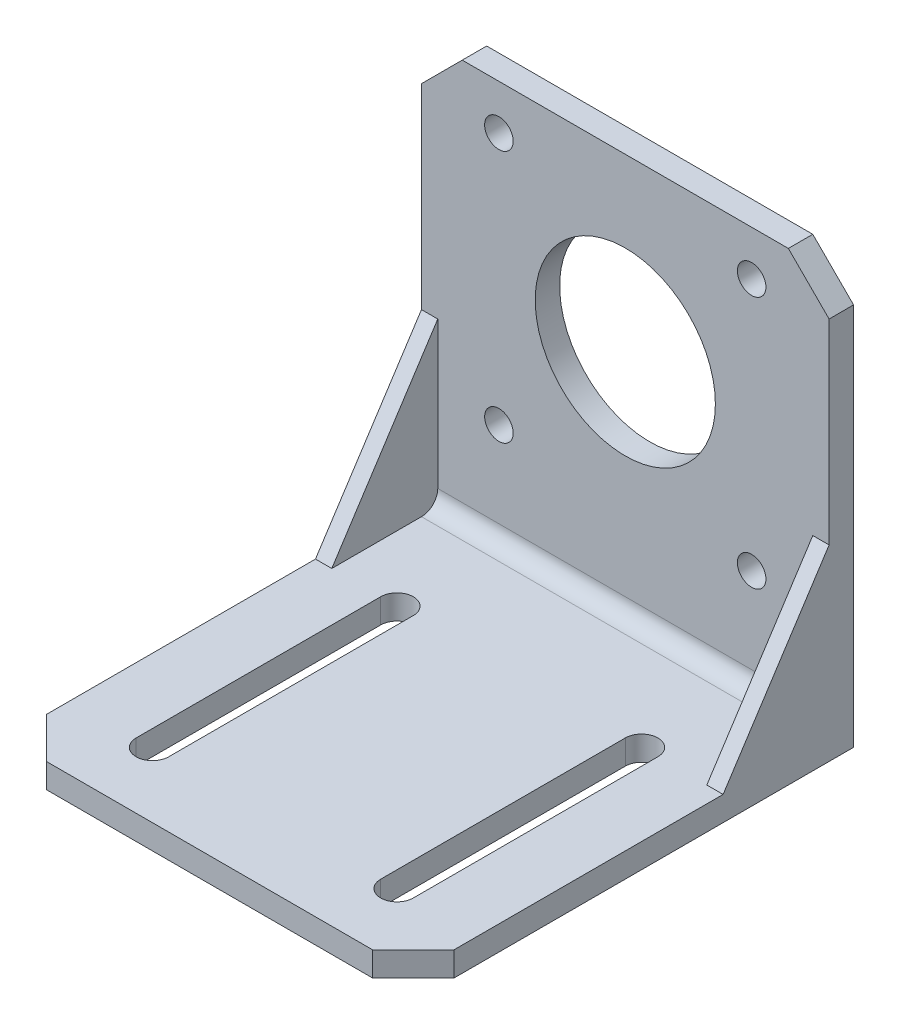
ISO-10303-21;
HEADER;
FILE_DESCRIPTION(('STEP AP214'),'2;1');
FILE_NAME('part.step','',(''),(''),'','','');
FILE_SCHEMA(('AUTOMOTIVE_DESIGN { 1 0 10303 214 1 1 1 1 }'));
ENDSEC;
DATA;
#1=APPLICATION_CONTEXT('core data for automotive mechanical design processes');
#2=APPLICATION_PROTOCOL_DEFINITION('international standard','automotive_design',2000,#1);
#3=PRODUCT_CONTEXT('',#1,'mechanical');
#4=PRODUCT('Part','Part','',(#3));
#5=PRODUCT_RELATED_PRODUCT_CATEGORY('part','',(#4));
#6=PRODUCT_DEFINITION_FORMATION('','',#4);
#7=PRODUCT_DEFINITION_CONTEXT('part definition',#1,'design');
#8=PRODUCT_DEFINITION('design','',#6,#7);
#9=PRODUCT_DEFINITION_SHAPE('','',#8);
#10=(LENGTH_UNIT() NAMED_UNIT(*) SI_UNIT(.MILLI.,.METRE.));
#11=(NAMED_UNIT(*) PLANE_ANGLE_UNIT() SI_UNIT($,.RADIAN.));
#12=(NAMED_UNIT(*) SI_UNIT($,.STERADIAN.) SOLID_ANGLE_UNIT());
#13=UNCERTAINTY_MEASURE_WITH_UNIT(LENGTH_MEASURE(1.E-05),#10,'distance_accuracy_value','');
#14=(GEOMETRIC_REPRESENTATION_CONTEXT(3) GLOBAL_UNCERTAINTY_ASSIGNED_CONTEXT((#13)) GLOBAL_UNIT_ASSIGNED_CONTEXT((#10,
#11,#12)) REPRESENTATION_CONTEXT('',''));
#15=CARTESIAN_POINT('',(0.,0.,0.));
#16=DIRECTION('',(0.,0.,1.));
#17=DIRECTION('',(1.,0.,0.));
#18=AXIS2_PLACEMENT_3D('',#15,#16,#17);
#19=CARTESIAN_POINT('',(20.,21.,-3.));
#20=DIRECTION('',(0.707106781186547,0.707106781186547,0.));
#21=DIRECTION('',(-0.707106781186548,0.707106781186548,0.));
#22=AXIS2_PLACEMENT_3D('',#19,#20,#21);
#23=PLANE('',#22);
#24=DIRECTION('',(-0.707106781186548,0.707106781186548,0.));
#25=VECTOR('',#24,1.);
#26=CARTESIAN_POINT('',(20.,21.,0.));
#27=LINE('',#26,#25);
#28=CARTESIAN_POINT('',(25.,16.,0.));
#29=VERTEX_POINT('',#28);
#30=CARTESIAN_POINT('',(20.,21.,0.));
#31=VERTEX_POINT('',#30);
#32=EDGE_CURVE('E357',#29,#31,#27,.T.);
#33=ORIENTED_EDGE('',*,*,#32,.F.);
#34=DIRECTION('',(0.,0.,1.));
#35=VECTOR('',#34,1.);
#36=CARTESIAN_POINT('',(25.,16.,-3.));
#37=LINE('',#36,#35);
#38=CARTESIAN_POINT('',(25.,16.,-3.));
#39=VERTEX_POINT('',#38);
#40=EDGE_CURVE('E386',#39,#29,#37,.T.);
#41=ORIENTED_EDGE('',*,*,#40,.F.);
#42=DIRECTION('',(-0.707106781186548,0.707106781186548,0.));
#43=VECTOR('',#42,1.);
#44=CARTESIAN_POINT('',(20.,21.,-3.));
#45=LINE('',#44,#43);
#46=CARTESIAN_POINT('',(20.,21.,-3.));
#47=VERTEX_POINT('',#46);
#48=EDGE_CURVE('E360',#39,#47,#45,.T.);
#49=ORIENTED_EDGE('',*,*,#48,.T.);
#50=DIRECTION('',(0.,0.,1.));
#51=VECTOR('',#50,1.);
#52=CARTESIAN_POINT('',(20.,21.,-3.));
#53=LINE('',#52,#51);
#54=EDGE_CURVE('E374',#47,#31,#53,.T.);
#55=ORIENTED_EDGE('',*,*,#54,.T.);
#56=EDGE_LOOP('',(#33,#41,#49,#55));
#57=FACE_BOUND('',#56,.T.);
#58=ADVANCED_FACE('F41',(#57),#23,.T.);
#59=CARTESIAN_POINT('',(25.,16.,-3.));
#60=DIRECTION('',(1.,0.,0.));
#61=DIRECTION('',(0.,1.,0.));
#62=AXIS2_PLACEMENT_3D('',#59,#60,#61);
#63=PLANE('',#62);
#64=DIRECTION('',(0.,1.,0.));
#65=VECTOR('',#64,1.);
#66=CARTESIAN_POINT('',(25.,-31.,46.));
#67=LINE('',#66,#65);
#68=CARTESIAN_POINT('',(25.,-31.,46.));
#69=VERTEX_POINT('',#68);
#70=CARTESIAN_POINT('',(25.,-28.,46.));
#71=VERTEX_POINT('',#70);
#72=EDGE_CURVE('E326',#69,#71,#67,.T.);
#73=ORIENTED_EDGE('',*,*,#72,.F.);
#74=DIRECTION('',(0.,0.,1.));
#75=VECTOR('',#74,1.);
#76=CARTESIAN_POINT('',(25.,-31.,-3.));
#77=LINE('',#76,#75);
#78=CARTESIAN_POINT('',(25.,-31.,-3.));
#79=VERTEX_POINT('',#78);
#80=EDGE_CURVE('E296',#79,#69,#77,.T.);
#81=ORIENTED_EDGE('',*,*,#80,.F.);
#82=DIRECTION('',(0.,1.,0.));
#83=VECTOR('',#82,1.);
#84=CARTESIAN_POINT('',(25.,16.,-3.));
#85=LINE('',#84,#83);
#86=EDGE_CURVE('E372',#79,#39,#85,.T.);
#87=ORIENTED_EDGE('',*,*,#86,.T.);
#88=ORIENTED_EDGE('',*,*,#40,.T.);
#89=DIRECTION('',(0.,1.,0.));
#90=VECTOR('',#89,1.);
#91=CARTESIAN_POINT('',(25.,16.,0.));
#92=LINE('',#91,#90);
#93=CARTESIAN_POINT('',(25.,-8.,0.));
#94=VERTEX_POINT('',#93);
#95=EDGE_CURVE('E364',#94,#29,#92,.T.);
#96=ORIENTED_EDGE('',*,*,#95,.F.);
#97=DIRECTION('',(0.,-0.838443616300637,0.544988350595414));
#98=VECTOR('',#97,1.);
#99=CARTESIAN_POINT('',(25.,-8.,0.));
#100=LINE('',#99,#98);
#101=CARTESIAN_POINT('',(25.,-28.,13.));
#102=VERTEX_POINT('',#101);
#103=EDGE_CURVE('E213',#94,#102,#100,.T.);
#104=ORIENTED_EDGE('',*,*,#103,.T.);
#105=DIRECTION('',(0.,0.,1.));
#106=VECTOR('',#105,1.);
#107=CARTESIAN_POINT('',(25.,-28.,-3.));
#108=LINE('',#107,#106);
#109=EDGE_CURVE('E204',#102,#71,#108,.T.);
#110=ORIENTED_EDGE('',*,*,#109,.T.);
#111=EDGE_LOOP('',(#73,#81,#87,#88,#96,#104,#110));
#112=FACE_BOUND('',#111,.T.);
#113=ADVANCED_FACE('F435',(#112),#63,.T.);
#114=CARTESIAN_POINT('',(-25.,16.,-3.));
#115=DIRECTION('',(-1.,0.,0.));
#116=DIRECTION('',(0.,-1.,0.));
#117=AXIS2_PLACEMENT_3D('',#114,#115,#116);
#118=PLANE('',#117);
#119=DIRECTION('',(0.,-0.838443616300637,0.544988350595414));
#120=VECTOR('',#119,1.);
#121=CARTESIAN_POINT('',(-25.,-8.,0.));
#122=LINE('',#121,#120);
#123=CARTESIAN_POINT('',(-25.,-8.,0.));
#124=VERTEX_POINT('',#123);
#125=CARTESIAN_POINT('',(-25.,-28.,13.));
#126=VERTEX_POINT('',#125);
#127=EDGE_CURVE('E221',#124,#126,#122,.T.);
#128=ORIENTED_EDGE('',*,*,#127,.F.);
#129=DIRECTION('',(0.,-1.,0.));
#130=VECTOR('',#129,1.);
#131=CARTESIAN_POINT('',(-25.,16.,0.));
#132=LINE('',#131,#130);
#133=CARTESIAN_POINT('',(-25.,16.,0.));
#134=VERTEX_POINT('',#133);
#135=EDGE_CURVE('E383',#134,#124,#132,.T.);
#136=ORIENTED_EDGE('',*,*,#135,.F.);
#137=DIRECTION('',(0.,0.,1.));
#138=VECTOR('',#137,1.);
#139=CARTESIAN_POINT('',(-25.,16.,-3.));
#140=LINE('',#139,#138);
#141=CARTESIAN_POINT('',(-25.,16.,-3.));
#142=VERTEX_POINT('',#141);
#143=EDGE_CURVE('E390',#142,#134,#140,.T.);
#144=ORIENTED_EDGE('',*,*,#143,.F.);
#145=DIRECTION('',(0.,-1.,0.));
#146=VECTOR('',#145,1.);
#147=CARTESIAN_POINT('',(-25.,16.,-3.));
#148=LINE('',#147,#146);
#149=CARTESIAN_POINT('',(-25.,-31.,-3.));
#150=VERTEX_POINT('',#149);
#151=EDGE_CURVE('E370',#142,#150,#148,.T.);
#152=ORIENTED_EDGE('',*,*,#151,.T.);
#153=DIRECTION('',(0.,0.,-1.));
#154=VECTOR('',#153,1.);
#155=CARTESIAN_POINT('',(-25.,-31.,-3.));
#156=LINE('',#155,#154);
#157=CARTESIAN_POINT('',(-25.,-31.,46.));
#158=VERTEX_POINT('',#157);
#159=EDGE_CURVE('E305',#158,#150,#156,.T.);
#160=ORIENTED_EDGE('',*,*,#159,.F.);
#161=DIRECTION('',(0.,1.,0.));
#162=VECTOR('',#161,1.);
#163=CARTESIAN_POINT('',(-25.,-31.,46.));
#164=LINE('',#163,#162);
#165=CARTESIAN_POINT('',(-25.,-28.,46.));
#166=VERTEX_POINT('',#165);
#167=EDGE_CURVE('E308',#158,#166,#164,.T.);
#168=ORIENTED_EDGE('',*,*,#167,.T.);
#169=DIRECTION('',(0.,0.,-1.));
#170=VECTOR('',#169,1.);
#171=CARTESIAN_POINT('',(-25.,-28.,-3.));
#172=LINE('',#171,#170);
#173=EDGE_CURVE('E297',#166,#126,#172,.T.);
#174=ORIENTED_EDGE('',*,*,#173,.T.);
#175=EDGE_LOOP('',(#128,#136,#144,#152,#160,#168,#174));
#176=FACE_BOUND('',#175,.T.);
#177=ADVANCED_FACE('F416',(#176),#118,.T.);
#178=CARTESIAN_POINT('',(-25.,16.,-3.));
#179=DIRECTION('',(-0.707106781186548,0.707106781186547,0.));
#180=DIRECTION('',(-0.707106781186547,-0.707106781186548,0.));
#181=AXIS2_PLACEMENT_3D('',#178,#179,#180);
#182=PLANE('',#181);
#183=DIRECTION('',(-0.707106781186547,-0.707106781186548,0.));
#184=VECTOR('',#183,1.);
#185=CARTESIAN_POINT('',(-25.,16.,0.));
#186=LINE('',#185,#184);
#187=CARTESIAN_POINT('',(-20.,21.,0.));
#188=VERTEX_POINT('',#187);
#189=EDGE_CURVE('E380',#188,#134,#186,.T.);
#190=ORIENTED_EDGE('',*,*,#189,.F.);
#191=DIRECTION('',(0.,0.,1.));
#192=VECTOR('',#191,1.);
#193=CARTESIAN_POINT('',(-20.,21.,-3.));
#194=LINE('',#193,#192);
#195=CARTESIAN_POINT('',(-20.,21.,-3.));
#196=VERTEX_POINT('',#195);
#197=EDGE_CURVE('E392',#196,#188,#194,.T.);
#198=ORIENTED_EDGE('',*,*,#197,.F.);
#199=DIRECTION('',(-0.707106781186547,-0.707106781186548,0.));
#200=VECTOR('',#199,1.);
#201=CARTESIAN_POINT('',(-25.,16.,-3.));
#202=LINE('',#201,#200);
#203=EDGE_CURVE('E367',#196,#142,#202,.T.);
#204=ORIENTED_EDGE('',*,*,#203,.T.);
#205=ORIENTED_EDGE('',*,*,#143,.T.);
#206=EDGE_LOOP('',(#190,#198,#204,#205));
#207=FACE_BOUND('',#206,.T.);
#208=ADVANCED_FACE('F448',(#207),#182,.T.);
#209=CARTESIAN_POINT('',(-20.,21.,-3.));
#210=DIRECTION('',(0.,1.,0.));
#211=DIRECTION('',(0.,0.,1.));
#212=AXIS2_PLACEMENT_3D('',#209,#210,#211);
#213=PLANE('',#212);
#214=DIRECTION('',(-1.,0.,0.));
#215=VECTOR('',#214,1.);
#216=CARTESIAN_POINT('',(-20.,21.,0.));
#217=LINE('',#216,#215);
#218=EDGE_CURVE('E377',#31,#188,#217,.T.);
#219=ORIENTED_EDGE('',*,*,#218,.F.);
#220=ORIENTED_EDGE('',*,*,#54,.F.);
#221=DIRECTION('',(-1.,0.,0.));
#222=VECTOR('',#221,1.);
#223=CARTESIAN_POINT('',(-20.,21.,-3.));
#224=LINE('',#223,#222);
#225=EDGE_CURVE('E363',#47,#196,#224,.T.);
#226=ORIENTED_EDGE('',*,*,#225,.T.);
#227=ORIENTED_EDGE('',*,*,#197,.T.);
#228=EDGE_LOOP('',(#219,#220,#226,#227));
#229=FACE_BOUND('',#228,.T.);
#230=ADVANCED_FACE('F444',(#229),#213,.T.);
#231=CARTESIAN_POINT('',(0.,0.,-3.));
#232=DIRECTION('',(0.,0.,1.));
#233=DIRECTION('',(1.,0.,0.));
#234=AXIS2_PLACEMENT_3D('',#231,#232,#233);
#235=PLANE('',#234);
#236=ORIENTED_EDGE('',*,*,#48,.F.);
#237=ORIENTED_EDGE('',*,*,#86,.F.);
#238=DIRECTION('',(1.,0.,0.));
#239=VECTOR('',#238,1.);
#240=CARTESIAN_POINT('',(-25.,-31.,-3.));
#241=LINE('',#240,#239);
#242=EDGE_CURVE('E294',#150,#79,#241,.T.);
#243=ORIENTED_EDGE('',*,*,#242,.F.);
#244=ORIENTED_EDGE('',*,*,#151,.F.);
#245=ORIENTED_EDGE('',*,*,#203,.F.);
#246=ORIENTED_EDGE('',*,*,#225,.F.);
#247=EDGE_LOOP('',(#236,#237,#243,#244,#245,#246));
#248=FACE_BOUND('',#247,.T.);
#249=CARTESIAN_POINT('',(-15.5,15.5,-3.));
#250=DIRECTION('',(0.,0.,1.));
#251=DIRECTION('',(-1.,0.,0.));
#252=AXIS2_PLACEMENT_3D('',#249,#250,#251);
#253=CIRCLE('',#252,1.75);
#254=CARTESIAN_POINT('',(-17.25,15.5,-3.));
#255=VERTEX_POINT('',#254);
#256=EDGE_CURVE('E330',#255,#255,#253,.T.);
#257=ORIENTED_EDGE('',*,*,#256,.T.);
#258=EDGE_LOOP('',(#257));
#259=FACE_BOUND('',#258,.T.);
#260=CARTESIAN_POINT('',(-15.5,-15.5,-3.));
#261=DIRECTION('',(0.,0.,1.));
#262=DIRECTION('',(-1.,0.,0.));
#263=AXIS2_PLACEMENT_3D('',#260,#261,#262);
#264=CIRCLE('',#263,1.75);
#265=CARTESIAN_POINT('',(-17.25,-15.5,-3.));
#266=VERTEX_POINT('',#265);
#267=EDGE_CURVE('E336',#266,#266,#264,.T.);
#268=ORIENTED_EDGE('',*,*,#267,.T.);
#269=EDGE_LOOP('',(#268));
#270=FACE_BOUND('',#269,.T.);
#271=CARTESIAN_POINT('',(15.5,-15.5,-3.));
#272=DIRECTION('',(0.,0.,1.));
#273=DIRECTION('',(1.,0.,0.));
#274=AXIS2_PLACEMENT_3D('',#271,#272,#273);
#275=CIRCLE('',#274,1.75);
#276=CARTESIAN_POINT('',(17.25,-15.5,-3.));
#277=VERTEX_POINT('',#276);
#278=EDGE_CURVE('E342',#277,#277,#275,.T.);
#279=ORIENTED_EDGE('',*,*,#278,.T.);
#280=EDGE_LOOP('',(#279));
#281=FACE_BOUND('',#280,.T.);
#282=CARTESIAN_POINT('',(15.5,15.5,-3.));
#283=DIRECTION('',(0.,0.,1.));
#284=DIRECTION('',(1.,0.,0.));
#285=AXIS2_PLACEMENT_3D('',#282,#283,#284);
#286=CIRCLE('',#285,1.75);
#287=CARTESIAN_POINT('',(17.25,15.5,-3.));
#288=VERTEX_POINT('',#287);
#289=EDGE_CURVE('E348',#288,#288,#286,.T.);
#290=ORIENTED_EDGE('',*,*,#289,.T.);
#291=EDGE_LOOP('',(#290));
#292=FACE_BOUND('',#291,.T.);
#293=CARTESIAN_POINT('',(0.,0.,-3.));
#294=DIRECTION('',(0.,0.,1.));
#295=DIRECTION('',(1.,0.,0.));
#296=AXIS2_PLACEMENT_3D('',#293,#294,#295);
#297=CIRCLE('',#296,11.05);
#298=CARTESIAN_POINT('',(11.05,0.,-3.));
#299=VERTEX_POINT('',#298);
#300=EDGE_CURVE('E354',#299,#299,#297,.T.);
#301=ORIENTED_EDGE('',*,*,#300,.T.);
#302=EDGE_LOOP('',(#301));
#303=FACE_BOUND('',#302,.T.);
#304=ADVANCED_FACE('F452',(#248,#259,#270,#281,#292,#303),#235,.F.);
#305=CARTESIAN_POINT('',(0.,0.,0.));
#306=DIRECTION('',(0.,0.,1.));
#307=DIRECTION('',(1.,0.,0.));
#308=AXIS2_PLACEMENT_3D('',#305,#306,#307);
#309=PLANE('',#308);
#310=DIRECTION('',(0.,-1.,0.));
#311=VECTOR('',#310,1.);
#312=CARTESIAN_POINT('',(-23.,0.,0.));
#313=LINE('',#312,#311);
#314=CARTESIAN_POINT('',(-23.,-8.,0.));
#315=VERTEX_POINT('',#314);
#316=CARTESIAN_POINT('',(-23.,-26.,0.));
#317=VERTEX_POINT('',#316);
#318=EDGE_CURVE('E224',#315,#317,#313,.T.);
#319=ORIENTED_EDGE('',*,*,#318,.T.);
#320=DIRECTION('',(1.,0.,0.));
#321=VECTOR('',#320,1.);
#322=CARTESIAN_POINT('',(0.,-26.,0.));
#323=LINE('',#322,#321);
#324=CARTESIAN_POINT('',(23.,-26.,0.));
#325=VERTEX_POINT('',#324);
#326=EDGE_CURVE('E208',#317,#325,#323,.T.);
#327=ORIENTED_EDGE('',*,*,#326,.T.);
#328=DIRECTION('',(0.,1.,0.));
#329=VECTOR('',#328,1.);
#330=CARTESIAN_POINT('',(23.,0.,0.));
#331=LINE('',#330,#329);
#332=CARTESIAN_POINT('',(23.,-8.,0.));
#333=VERTEX_POINT('',#332);
#334=EDGE_CURVE('E215',#325,#333,#331,.T.);
#335=ORIENTED_EDGE('',*,*,#334,.T.);
#336=DIRECTION('',(-1.,0.,0.));
#337=VECTOR('',#336,1.);
#338=CARTESIAN_POINT('',(0.,-8.,0.));
#339=LINE('',#338,#337);
#340=EDGE_CURVE('E212',#94,#333,#339,.T.);
#341=ORIENTED_EDGE('',*,*,#340,.F.);
#342=ORIENTED_EDGE('',*,*,#95,.T.);
#343=ORIENTED_EDGE('',*,*,#32,.T.);
#344=ORIENTED_EDGE('',*,*,#218,.T.);
#345=ORIENTED_EDGE('',*,*,#189,.T.);
#346=ORIENTED_EDGE('',*,*,#135,.T.);
#347=DIRECTION('',(1.,0.,0.));
#348=VECTOR('',#347,1.);
#349=CARTESIAN_POINT('',(0.,-8.,0.));
#350=LINE('',#349,#348);
#351=EDGE_CURVE('E229',#315,#124,#350,.F.);
#352=ORIENTED_EDGE('',*,*,#351,.F.);
#353=EDGE_LOOP('',(#319,#327,#335,#341,#342,#343,#344,#345,#346,#352));
#354=FACE_BOUND('',#353,.T.);
#355=CARTESIAN_POINT('',(-15.5,15.5,0.));
#356=DIRECTION('',(0.,0.,1.));
#357=DIRECTION('',(-1.,0.,0.));
#358=AXIS2_PLACEMENT_3D('',#355,#356,#357);
#359=CIRCLE('',#358,1.75);
#360=CARTESIAN_POINT('',(-17.25,15.5,0.));
#361=VERTEX_POINT('',#360);
#362=EDGE_CURVE('E329',#361,#361,#359,.T.);
#363=ORIENTED_EDGE('',*,*,#362,.F.);
#364=EDGE_LOOP('',(#363));
#365=FACE_BOUND('',#364,.T.);
#366=CARTESIAN_POINT('',(-15.5,-15.5,0.));
#367=DIRECTION('',(0.,0.,1.));
#368=DIRECTION('',(-1.,0.,0.));
#369=AXIS2_PLACEMENT_3D('',#366,#367,#368);
#370=CIRCLE('',#369,1.75);
#371=CARTESIAN_POINT('',(-17.25,-15.5,0.));
#372=VERTEX_POINT('',#371);
#373=EDGE_CURVE('E333',#372,#372,#370,.T.);
#374=ORIENTED_EDGE('',*,*,#373,.F.);
#375=EDGE_LOOP('',(#374));
#376=FACE_BOUND('',#375,.T.);
#377=CARTESIAN_POINT('',(15.5,-15.5,0.));
#378=DIRECTION('',(0.,0.,1.));
#379=DIRECTION('',(1.,0.,0.));
#380=AXIS2_PLACEMENT_3D('',#377,#378,#379);
#381=CIRCLE('',#380,1.75);
#382=CARTESIAN_POINT('',(17.25,-15.5,0.));
#383=VERTEX_POINT('',#382);
#384=EDGE_CURVE('E339',#383,#383,#381,.T.);
#385=ORIENTED_EDGE('',*,*,#384,.F.);
#386=EDGE_LOOP('',(#385));
#387=FACE_BOUND('',#386,.T.);
#388=CARTESIAN_POINT('',(15.5,15.5,0.));
#389=DIRECTION('',(0.,0.,1.));
#390=DIRECTION('',(1.,0.,0.));
#391=AXIS2_PLACEMENT_3D('',#388,#389,#390);
#392=CIRCLE('',#391,1.75);
#393=CARTESIAN_POINT('',(17.25,15.5,0.));
#394=VERTEX_POINT('',#393);
#395=EDGE_CURVE('E345',#394,#394,#392,.T.);
#396=ORIENTED_EDGE('',*,*,#395,.F.);
#397=EDGE_LOOP('',(#396));
#398=FACE_BOUND('',#397,.T.);
#399=CARTESIAN_POINT('',(0.,0.,0.));
#400=DIRECTION('',(0.,0.,1.));
#401=DIRECTION('',(1.,0.,0.));
#402=AXIS2_PLACEMENT_3D('',#399,#400,#401);
#403=CIRCLE('',#402,11.05);
#404=CARTESIAN_POINT('',(11.05,0.,0.));
#405=VERTEX_POINT('',#404);
#406=EDGE_CURVE('E351',#405,#405,#403,.T.);
#407=ORIENTED_EDGE('',*,*,#406,.F.);
#408=EDGE_LOOP('',(#407));
#409=FACE_BOUND('',#408,.T.);
#410=ADVANCED_FACE('F401',(#354,#365,#376,#387,#398,#409),#309,.T.);
#411=CARTESIAN_POINT('',(0.,0.,-3.));
#412=DIRECTION('',(0.,0.,1.));
#413=DIRECTION('',(1.,0.,0.));
#414=AXIS2_PLACEMENT_3D('',#411,#412,#413);
#415=CYLINDRICAL_SURFACE('',#414,11.05);
#416=ORIENTED_EDGE('',*,*,#300,.F.);
#417=EDGE_LOOP('',(#416));
#418=FACE_BOUND('',#417,.T.);
#419=ORIENTED_EDGE('',*,*,#406,.T.);
#420=EDGE_LOOP('',(#419));
#421=FACE_BOUND('',#420,.T.);
#422=ADVANCED_FACE('F505',(#418,#421),#415,.F.);
#423=CARTESIAN_POINT('',(15.5,15.5,-3.));
#424=DIRECTION('',(0.,0.,1.));
#425=DIRECTION('',(1.,0.,0.));
#426=AXIS2_PLACEMENT_3D('',#423,#424,#425);
#427=CYLINDRICAL_SURFACE('',#426,1.75);
#428=ORIENTED_EDGE('',*,*,#289,.F.);
#429=EDGE_LOOP('',(#428));
#430=FACE_BOUND('',#429,.T.);
#431=ORIENTED_EDGE('',*,*,#395,.T.);
#432=EDGE_LOOP('',(#431));
#433=FACE_BOUND('',#432,.T.);
#434=ADVANCED_FACE('F510',(#430,#433),#427,.F.);
#435=CARTESIAN_POINT('',(15.5,-15.5,-3.));
#436=DIRECTION('',(0.,0.,1.));
#437=DIRECTION('',(1.,0.,0.));
#438=AXIS2_PLACEMENT_3D('',#435,#436,#437);
#439=CYLINDRICAL_SURFACE('',#438,1.75);
#440=ORIENTED_EDGE('',*,*,#278,.F.);
#441=EDGE_LOOP('',(#440));
#442=FACE_BOUND('',#441,.T.);
#443=ORIENTED_EDGE('',*,*,#384,.T.);
#444=EDGE_LOOP('',(#443));
#445=FACE_BOUND('',#444,.T.);
#446=ADVANCED_FACE('F514',(#442,#445),#439,.F.);
#447=CARTESIAN_POINT('',(-15.5,-15.5,-3.));
#448=DIRECTION('',(0.,0.,1.));
#449=DIRECTION('',(1.,0.,0.));
#450=AXIS2_PLACEMENT_3D('',#447,#448,#449);
#451=CYLINDRICAL_SURFACE('',#450,1.75);
#452=ORIENTED_EDGE('',*,*,#267,.F.);
#453=EDGE_LOOP('',(#452));
#454=FACE_BOUND('',#453,.T.);
#455=ORIENTED_EDGE('',*,*,#373,.T.);
#456=EDGE_LOOP('',(#455));
#457=FACE_BOUND('',#456,.T.);
#458=ADVANCED_FACE('F518',(#454,#457),#451,.F.);
#459=CARTESIAN_POINT('',(-15.5,15.5,-3.));
#460=DIRECTION('',(0.,0.,1.));
#461=DIRECTION('',(1.,0.,0.));
#462=AXIS2_PLACEMENT_3D('',#459,#460,#461);
#463=CYLINDRICAL_SURFACE('',#462,1.75);
#464=ORIENTED_EDGE('',*,*,#256,.F.);
#465=EDGE_LOOP('',(#464));
#466=FACE_BOUND('',#465,.T.);
#467=ORIENTED_EDGE('',*,*,#362,.T.);
#468=EDGE_LOOP('',(#467));
#469=FACE_BOUND('',#468,.T.);
#470=ADVANCED_FACE('F459',(#466,#469),#463,.F.);
#471=CARTESIAN_POINT('',(0.,-31.,0.));
#472=DIRECTION('',(0.,-1.,0.));
#473=DIRECTION('',(0.,0.,-1.));
#474=AXIS2_PLACEMENT_3D('',#471,#472,#473);
#475=PLANE('',#474);
#476=ORIENTED_EDGE('',*,*,#80,.T.);
#477=DIRECTION('',(-0.707106781186548,0.,0.707106781186547));
#478=VECTOR('',#477,1.);
#479=CARTESIAN_POINT('',(25.,-31.,46.));
#480=LINE('',#479,#478);
#481=CARTESIAN_POINT('',(20.,-31.,51.));
#482=VERTEX_POINT('',#481);
#483=EDGE_CURVE('E299',#69,#482,#480,.T.);
#484=ORIENTED_EDGE('',*,*,#483,.T.);
#485=DIRECTION('',(-1.,0.,0.));
#486=VECTOR('',#485,1.);
#487=CARTESIAN_POINT('',(-20.,-31.,51.));
#488=LINE('',#487,#486);
#489=CARTESIAN_POINT('',(-20.,-31.,51.));
#490=VERTEX_POINT('',#489);
#491=EDGE_CURVE('E301',#482,#490,#488,.T.);
#492=ORIENTED_EDGE('',*,*,#491,.T.);
#493=DIRECTION('',(-0.707106781186548,0.,-0.707106781186547));
#494=VECTOR('',#493,1.);
#495=CARTESIAN_POINT('',(-25.,-31.,46.));
#496=LINE('',#495,#494);
#497=EDGE_CURVE('E303',#490,#158,#496,.T.);
#498=ORIENTED_EDGE('',*,*,#497,.T.);
#499=ORIENTED_EDGE('',*,*,#159,.T.);
#500=ORIENTED_EDGE('',*,*,#242,.T.);
#501=EDGE_LOOP('',(#476,#484,#492,#498,#499,#500));
#502=FACE_BOUND('',#501,.T.);
#503=DIRECTION('',(0.,0.,-1.));
#504=VECTOR('',#503,1.);
#505=CARTESIAN_POINT('',(-17.,-31.,43.));
#506=LINE('',#505,#504);
#507=CARTESIAN_POINT('',(-17.,-31.,43.));
#508=VERTEX_POINT('',#507);
#509=CARTESIAN_POINT('',(-17.,-31.,13.));
#510=VERTEX_POINT('',#509);
#511=EDGE_CURVE('E266',#508,#510,#506,.T.);
#512=ORIENTED_EDGE('',*,*,#511,.F.);
#513=CARTESIAN_POINT('',(-15.,-31.,43.));
#514=DIRECTION('',(0.,-1.,0.));
#515=DIRECTION('',(0.,0.,-1.));
#516=AXIS2_PLACEMENT_3D('',#513,#514,#515);
#517=CIRCLE('',#516,2.);
#518=CARTESIAN_POINT('',(-13.,-31.,43.));
#519=VERTEX_POINT('',#518);
#520=EDGE_CURVE('E264',#519,#508,#517,.T.);
#521=ORIENTED_EDGE('',*,*,#520,.F.);
#522=DIRECTION('',(0.,0.,1.));
#523=VECTOR('',#522,1.);
#524=CARTESIAN_POINT('',(-13.,-31.,43.));
#525=LINE('',#524,#523);
#526=CARTESIAN_POINT('',(-13.,-31.,13.));
#527=VERTEX_POINT('',#526);
#528=EDGE_CURVE('E272',#527,#519,#525,.T.);
#529=ORIENTED_EDGE('',*,*,#528,.F.);
#530=CARTESIAN_POINT('',(-15.,-31.,13.));
#531=DIRECTION('',(0.,-1.,0.));
#532=DIRECTION('',(0.,0.,-1.));
#533=AXIS2_PLACEMENT_3D('',#530,#531,#532);
#534=CIRCLE('',#533,1.99999999999999);
#535=EDGE_CURVE('E269',#510,#527,#534,.T.);
#536=ORIENTED_EDGE('',*,*,#535,.F.);
#537=EDGE_LOOP('',(#512,#521,#529,#536));
#538=FACE_BOUND('',#537,.T.);
#539=DIRECTION('',(0.,0.,-1.));
#540=VECTOR('',#539,1.);
#541=CARTESIAN_POINT('',(13.,-31.,43.));
#542=LINE('',#541,#540);
#543=CARTESIAN_POINT('',(13.,-31.,43.));
#544=VERTEX_POINT('',#543);
#545=CARTESIAN_POINT('',(13.,-31.,13.));
#546=VERTEX_POINT('',#545);
#547=EDGE_CURVE('E235',#544,#546,#542,.T.);
#548=ORIENTED_EDGE('',*,*,#547,.F.);
#549=CARTESIAN_POINT('',(15.,-31.,43.));
#550=DIRECTION('',(0.,-1.,0.));
#551=DIRECTION('',(0.,0.,1.));
#552=AXIS2_PLACEMENT_3D('',#549,#550,#551);
#553=CIRCLE('',#552,2.);
#554=CARTESIAN_POINT('',(17.,-31.,43.));
#555=VERTEX_POINT('',#554);
#556=EDGE_CURVE('E233',#555,#544,#553,.T.);
#557=ORIENTED_EDGE('',*,*,#556,.F.);
#558=DIRECTION('',(0.,0.,1.));
#559=VECTOR('',#558,1.);
#560=CARTESIAN_POINT('',(17.,-31.,43.));
#561=LINE('',#560,#559);
#562=CARTESIAN_POINT('',(17.,-31.,13.));
#563=VERTEX_POINT('',#562);
#564=EDGE_CURVE('E241',#563,#555,#561,.T.);
#565=ORIENTED_EDGE('',*,*,#564,.F.);
#566=CARTESIAN_POINT('',(15.,-31.,13.));
#567=DIRECTION('',(0.,-1.,0.));
#568=DIRECTION('',(0.,0.,1.));
#569=AXIS2_PLACEMENT_3D('',#566,#567,#568);
#570=CIRCLE('',#569,1.99999999999999);
#571=EDGE_CURVE('E238',#546,#563,#570,.T.);
#572=ORIENTED_EDGE('',*,*,#571,.F.);
#573=EDGE_LOOP('',(#548,#557,#565,#572));
#574=FACE_BOUND('',#573,.T.);
#575=ADVANCED_FACE('F456',(#502,#538,#574),#475,.T.);
#576=CARTESIAN_POINT('',(0.,-28.,0.));
#577=DIRECTION('',(0.,-1.,0.));
#578=DIRECTION('',(0.,0.,-1.));
#579=AXIS2_PLACEMENT_3D('',#576,#577,#578);
#580=PLANE('',#579);
#581=DIRECTION('',(0.,0.,1.));
#582=VECTOR('',#581,1.);
#583=CARTESIAN_POINT('',(23.,-28.,0.));
#584=LINE('',#583,#582);
#585=CARTESIAN_POINT('',(23.,-28.,2.));
#586=VERTEX_POINT('',#585);
#587=CARTESIAN_POINT('',(23.,-28.,13.));
#588=VERTEX_POINT('',#587);
#589=EDGE_CURVE('E192',#586,#588,#584,.T.);
#590=ORIENTED_EDGE('',*,*,#589,.F.);
#591=DIRECTION('',(1.,0.,0.));
#592=VECTOR('',#591,1.);
#593=CARTESIAN_POINT('',(0.,-28.,2.));
#594=LINE('',#593,#592);
#595=CARTESIAN_POINT('',(-23.,-28.,2.));
#596=VERTEX_POINT('',#595);
#597=EDGE_CURVE('E49',#586,#596,#594,.F.);
#598=ORIENTED_EDGE('',*,*,#597,.T.);
#599=DIRECTION('',(0.,0.,-1.));
#600=VECTOR('',#599,1.);
#601=CARTESIAN_POINT('',(-23.,-28.,0.));
#602=LINE('',#601,#600);
#603=CARTESIAN_POINT('',(-23.,-28.,13.));
#604=VERTEX_POINT('',#603);
#605=EDGE_CURVE('E389',#604,#596,#602,.T.);
#606=ORIENTED_EDGE('',*,*,#605,.F.);
#607=DIRECTION('',(1.,0.,0.));
#608=VECTOR('',#607,1.);
#609=CARTESIAN_POINT('',(0.,-28.,13.));
#610=LINE('',#609,#608);
#611=EDGE_CURVE('E198',#604,#126,#610,.F.);
#612=ORIENTED_EDGE('',*,*,#611,.T.);
#613=ORIENTED_EDGE('',*,*,#173,.F.);
#614=DIRECTION('',(-0.707106781186548,0.,-0.707106781186547));
#615=VECTOR('',#614,1.);
#616=CARTESIAN_POINT('',(-25.,-28.,46.));
#617=LINE('',#616,#615);
#618=CARTESIAN_POINT('',(-20.,-28.,51.));
#619=VERTEX_POINT('',#618);
#620=EDGE_CURVE('E314',#619,#166,#617,.T.);
#621=ORIENTED_EDGE('',*,*,#620,.F.);
#622=DIRECTION('',(-1.,0.,0.));
#623=VECTOR('',#622,1.);
#624=CARTESIAN_POINT('',(-20.,-28.,51.));
#625=LINE('',#624,#623);
#626=CARTESIAN_POINT('',(20.,-28.,51.));
#627=VERTEX_POINT('',#626);
#628=EDGE_CURVE('E312',#627,#619,#625,.T.);
#629=ORIENTED_EDGE('',*,*,#628,.F.);
#630=DIRECTION('',(-0.707106781186548,0.,0.707106781186547));
#631=VECTOR('',#630,1.);
#632=CARTESIAN_POINT('',(25.,-28.,46.));
#633=LINE('',#632,#631);
#634=EDGE_CURVE('E310',#71,#627,#633,.T.);
#635=ORIENTED_EDGE('',*,*,#634,.F.);
#636=ORIENTED_EDGE('',*,*,#109,.F.);
#637=DIRECTION('',(-1.,0.,0.));
#638=VECTOR('',#637,1.);
#639=CARTESIAN_POINT('',(0.,-28.,13.));
#640=LINE('',#639,#638);
#641=EDGE_CURVE('E197',#102,#588,#640,.T.);
#642=ORIENTED_EDGE('',*,*,#641,.T.);
#643=EDGE_LOOP('',(#590,#598,#606,#612,#613,#621,#629,#635,#636,#642));
#644=FACE_BOUND('',#643,.T.);
#645=CARTESIAN_POINT('',(-15.,-28.,43.));
#646=DIRECTION('',(0.,-1.,0.));
#647=DIRECTION('',(0.,0.,-1.));
#648=AXIS2_PLACEMENT_3D('',#645,#646,#647);
#649=CIRCLE('',#648,2.);
#650=CARTESIAN_POINT('',(-13.,-28.,43.));
#651=VERTEX_POINT('',#650);
#652=CARTESIAN_POINT('',(-17.,-28.,43.));
#653=VERTEX_POINT('',#652);
#654=EDGE_CURVE('E263',#651,#653,#649,.T.);
#655=ORIENTED_EDGE('',*,*,#654,.T.);
#656=DIRECTION('',(0.,0.,-1.));
#657=VECTOR('',#656,1.);
#658=CARTESIAN_POINT('',(-17.,-28.,43.));
#659=LINE('',#658,#657);
#660=CARTESIAN_POINT('',(-17.,-28.,13.));
#661=VERTEX_POINT('',#660);
#662=EDGE_CURVE('E277',#653,#661,#659,.T.);
#663=ORIENTED_EDGE('',*,*,#662,.T.);
#664=CARTESIAN_POINT('',(-15.,-28.,13.));
#665=DIRECTION('',(0.,-1.,0.));
#666=DIRECTION('',(0.,0.,-1.));
#667=AXIS2_PLACEMENT_3D('',#664,#665,#666);
#668=CIRCLE('',#667,1.99999999999999);
#669=CARTESIAN_POINT('',(-13.,-28.,13.));
#670=VERTEX_POINT('',#669);
#671=EDGE_CURVE('E280',#661,#670,#668,.T.);
#672=ORIENTED_EDGE('',*,*,#671,.T.);
#673=DIRECTION('',(0.,0.,1.));
#674=VECTOR('',#673,1.);
#675=CARTESIAN_POINT('',(-13.,-28.,43.));
#676=LINE('',#675,#674);
#677=EDGE_CURVE('E267',#670,#651,#676,.T.);
#678=ORIENTED_EDGE('',*,*,#677,.T.);
#679=EDGE_LOOP('',(#655,#663,#672,#678));
#680=FACE_BOUND('',#679,.T.);
#681=CARTESIAN_POINT('',(15.,-28.,43.));
#682=DIRECTION('',(0.,-1.,0.));
#683=DIRECTION('',(0.,0.,1.));
#684=AXIS2_PLACEMENT_3D('',#681,#682,#683);
#685=CIRCLE('',#684,2.);
#686=CARTESIAN_POINT('',(17.,-28.,43.));
#687=VERTEX_POINT('',#686);
#688=CARTESIAN_POINT('',(13.,-28.,43.));
#689=VERTEX_POINT('',#688);
#690=EDGE_CURVE('E232',#687,#689,#685,.T.);
#691=ORIENTED_EDGE('',*,*,#690,.T.);
#692=DIRECTION('',(0.,0.,-1.));
#693=VECTOR('',#692,1.);
#694=CARTESIAN_POINT('',(13.,-28.,43.));
#695=LINE('',#694,#693);
#696=CARTESIAN_POINT('',(13.,-28.,13.));
#697=VERTEX_POINT('',#696);
#698=EDGE_CURVE('E246',#689,#697,#695,.T.);
#699=ORIENTED_EDGE('',*,*,#698,.T.);
#700=CARTESIAN_POINT('',(15.,-28.,13.));
#701=DIRECTION('',(0.,-1.,0.));
#702=DIRECTION('',(0.,0.,1.));
#703=AXIS2_PLACEMENT_3D('',#700,#701,#702);
#704=CIRCLE('',#703,1.99999999999999);
#705=CARTESIAN_POINT('',(17.,-28.,13.));
#706=VERTEX_POINT('',#705);
#707=EDGE_CURVE('E249',#697,#706,#704,.T.);
#708=ORIENTED_EDGE('',*,*,#707,.T.);
#709=DIRECTION('',(0.,0.,1.));
#710=VECTOR('',#709,1.);
#711=CARTESIAN_POINT('',(17.,-28.,43.));
#712=LINE('',#711,#710);
#713=EDGE_CURVE('E236',#706,#687,#712,.T.);
#714=ORIENTED_EDGE('',*,*,#713,.T.);
#715=EDGE_LOOP('',(#691,#699,#708,#714));
#716=FACE_BOUND('',#715,.T.);
#717=ADVANCED_FACE('F201',(#644,#680,#716),#580,.F.);
#718=CARTESIAN_POINT('',(25.,-31.,46.));
#719=DIRECTION('',(-0.707106781186547,0.,-0.707106781186548));
#720=DIRECTION('',(-0.707106781186548,0.,0.707106781186547));
#721=AXIS2_PLACEMENT_3D('',#718,#719,#720);
#722=PLANE('',#721);
#723=ORIENTED_EDGE('',*,*,#634,.T.);
#724=DIRECTION('',(0.,1.,0.));
#725=VECTOR('',#724,1.);
#726=CARTESIAN_POINT('',(20.,-31.,51.));
#727=LINE('',#726,#725);
#728=EDGE_CURVE('E323',#482,#627,#727,.T.);
#729=ORIENTED_EDGE('',*,*,#728,.F.);
#730=ORIENTED_EDGE('',*,*,#483,.F.);
#731=ORIENTED_EDGE('',*,*,#72,.T.);
#732=EDGE_LOOP('',(#723,#729,#730,#731));
#733=FACE_BOUND('',#732,.T.);
#734=ADVANCED_FACE('F431',(#733),#722,.F.);
#735=CARTESIAN_POINT('',(-20.,-31.,51.));
#736=DIRECTION('',(0.,0.,-1.));
#737=DIRECTION('',(-1.,0.,0.));
#738=AXIS2_PLACEMENT_3D('',#735,#736,#737);
#739=PLANE('',#738);
#740=ORIENTED_EDGE('',*,*,#628,.T.);
#741=DIRECTION('',(0.,1.,0.));
#742=VECTOR('',#741,1.);
#743=CARTESIAN_POINT('',(-20.,-31.,51.));
#744=LINE('',#743,#742);
#745=EDGE_CURVE('E320',#490,#619,#744,.T.);
#746=ORIENTED_EDGE('',*,*,#745,.F.);
#747=ORIENTED_EDGE('',*,*,#491,.F.);
#748=ORIENTED_EDGE('',*,*,#728,.T.);
#749=EDGE_LOOP('',(#740,#746,#747,#748));
#750=FACE_BOUND('',#749,.T.);
#751=ADVANCED_FACE('F427',(#750),#739,.F.);
#752=CARTESIAN_POINT('',(-25.,-31.,46.));
#753=DIRECTION('',(0.707106781186547,0.,-0.707106781186548));
#754=DIRECTION('',(-0.707106781186548,0.,-0.707106781186547));
#755=AXIS2_PLACEMENT_3D('',#752,#753,#754);
#756=PLANE('',#755);
#757=ORIENTED_EDGE('',*,*,#620,.T.);
#758=ORIENTED_EDGE('',*,*,#167,.F.);
#759=ORIENTED_EDGE('',*,*,#497,.F.);
#760=ORIENTED_EDGE('',*,*,#745,.T.);
#761=EDGE_LOOP('',(#757,#758,#759,#760));
#762=FACE_BOUND('',#761,.T.);
#763=ADVANCED_FACE('F422',(#762),#756,.F.);
#764=CARTESIAN_POINT('',(-15.,-31.,43.));
#765=DIRECTION('',(0.,1.,0.));
#766=DIRECTION('',(0.,0.,1.));
#767=AXIS2_PLACEMENT_3D('',#764,#765,#766);
#768=CYLINDRICAL_SURFACE('',#767,2.);
#769=ORIENTED_EDGE('',*,*,#654,.F.);
#770=DIRECTION('',(0.,1.,0.));
#771=VECTOR('',#770,1.);
#772=CARTESIAN_POINT('',(-13.,-31.,43.));
#773=LINE('',#772,#771);
#774=EDGE_CURVE('E274',#519,#651,#773,.T.);
#775=ORIENTED_EDGE('',*,*,#774,.F.);
#776=ORIENTED_EDGE('',*,*,#520,.T.);
#777=DIRECTION('',(0.,1.,0.));
#778=VECTOR('',#777,1.);
#779=CARTESIAN_POINT('',(-17.,-31.,43.));
#780=LINE('',#779,#778);
#781=EDGE_CURVE('E291',#508,#653,#780,.T.);
#782=ORIENTED_EDGE('',*,*,#781,.T.);
#783=EDGE_LOOP('',(#769,#775,#776,#782));
#784=FACE_BOUND('',#783,.T.);
#785=ADVANCED_FACE('F532',(#784),#768,.F.);
#786=CARTESIAN_POINT('',(-17.,-31.,43.));
#787=DIRECTION('',(1.,0.,0.));
#788=DIRECTION('',(0.,0.,-1.));
#789=AXIS2_PLACEMENT_3D('',#786,#787,#788);
#790=PLANE('',#789);
#791=ORIENTED_EDGE('',*,*,#662,.F.);
#792=ORIENTED_EDGE('',*,*,#781,.F.);
#793=ORIENTED_EDGE('',*,*,#511,.T.);
#794=DIRECTION('',(0.,1.,0.));
#795=VECTOR('',#794,1.);
#796=CARTESIAN_POINT('',(-17.,-31.,13.));
#797=LINE('',#796,#795);
#798=EDGE_CURVE('E289',#510,#661,#797,.T.);
#799=ORIENTED_EDGE('',*,*,#798,.T.);
#800=EDGE_LOOP('',(#791,#792,#793,#799));
#801=FACE_BOUND('',#800,.T.);
#802=ADVANCED_FACE('F537',(#801),#790,.T.);
#803=CARTESIAN_POINT('',(-15.,-31.,13.));
#804=DIRECTION('',(0.,1.,0.));
#805=DIRECTION('',(0.,0.,1.));
#806=AXIS2_PLACEMENT_3D('',#803,#804,#805);
#807=CYLINDRICAL_SURFACE('',#806,1.99999999999999);
#808=ORIENTED_EDGE('',*,*,#671,.F.);
#809=ORIENTED_EDGE('',*,*,#798,.F.);
#810=ORIENTED_EDGE('',*,*,#535,.T.);
#811=DIRECTION('',(0.,1.,0.));
#812=VECTOR('',#811,1.);
#813=CARTESIAN_POINT('',(-13.,-31.,13.));
#814=LINE('',#813,#812);
#815=EDGE_CURVE('E287',#527,#670,#814,.T.);
#816=ORIENTED_EDGE('',*,*,#815,.T.);
#817=EDGE_LOOP('',(#808,#809,#810,#816));
#818=FACE_BOUND('',#817,.T.);
#819=ADVANCED_FACE('F541',(#818),#807,.F.);
#820=CARTESIAN_POINT('',(-13.,-31.,43.));
#821=DIRECTION('',(-1.,0.,0.));
#822=DIRECTION('',(0.,0.,1.));
#823=AXIS2_PLACEMENT_3D('',#820,#821,#822);
#824=PLANE('',#823);
#825=ORIENTED_EDGE('',*,*,#677,.F.);
#826=ORIENTED_EDGE('',*,*,#815,.F.);
#827=ORIENTED_EDGE('',*,*,#528,.T.);
#828=ORIENTED_EDGE('',*,*,#774,.T.);
#829=EDGE_LOOP('',(#825,#826,#827,#828));
#830=FACE_BOUND('',#829,.T.);
#831=ADVANCED_FACE('F545',(#830),#824,.T.);
#832=CARTESIAN_POINT('',(15.,-31.,43.));
#833=DIRECTION('',(0.,1.,0.));
#834=DIRECTION('',(0.,0.,1.));
#835=AXIS2_PLACEMENT_3D('',#832,#833,#834);
#836=CYLINDRICAL_SURFACE('',#835,2.);
#837=ORIENTED_EDGE('',*,*,#690,.F.);
#838=DIRECTION('',(0.,1.,0.));
#839=VECTOR('',#838,1.);
#840=CARTESIAN_POINT('',(17.,-31.,43.));
#841=LINE('',#840,#839);
#842=EDGE_CURVE('E243',#555,#687,#841,.T.);
#843=ORIENTED_EDGE('',*,*,#842,.F.);
#844=ORIENTED_EDGE('',*,*,#556,.T.);
#845=DIRECTION('',(0.,1.,0.));
#846=VECTOR('',#845,1.);
#847=CARTESIAN_POINT('',(13.,-31.,43.));
#848=LINE('',#847,#846);
#849=EDGE_CURVE('E260',#544,#689,#848,.T.);
#850=ORIENTED_EDGE('',*,*,#849,.T.);
#851=EDGE_LOOP('',(#837,#843,#844,#850));
#852=FACE_BOUND('',#851,.T.);
#853=ADVANCED_FACE('F479',(#852),#836,.F.);
#854=CARTESIAN_POINT('',(13.,-31.,43.));
#855=DIRECTION('',(1.,0.,0.));
#856=DIRECTION('',(0.,0.,-1.));
#857=AXIS2_PLACEMENT_3D('',#854,#855,#856);
#858=PLANE('',#857);
#859=ORIENTED_EDGE('',*,*,#698,.F.);
#860=ORIENTED_EDGE('',*,*,#849,.F.);
#861=ORIENTED_EDGE('',*,*,#547,.T.);
#862=DIRECTION('',(0.,1.,0.));
#863=VECTOR('',#862,1.);
#864=CARTESIAN_POINT('',(13.,-31.,13.));
#865=LINE('',#864,#863);
#866=EDGE_CURVE('E258',#546,#697,#865,.T.);
#867=ORIENTED_EDGE('',*,*,#866,.T.);
#868=EDGE_LOOP('',(#859,#860,#861,#867));
#869=FACE_BOUND('',#868,.T.);
#870=ADVANCED_FACE('F472',(#869),#858,.T.);
#871=CARTESIAN_POINT('',(15.,-31.,13.));
#872=DIRECTION('',(0.,1.,0.));
#873=DIRECTION('',(0.,0.,1.));
#874=AXIS2_PLACEMENT_3D('',#871,#872,#873);
#875=CYLINDRICAL_SURFACE('',#874,1.99999999999999);
#876=ORIENTED_EDGE('',*,*,#707,.F.);
#877=ORIENTED_EDGE('',*,*,#866,.F.);
#878=ORIENTED_EDGE('',*,*,#571,.T.);
#879=DIRECTION('',(0.,1.,0.));
#880=VECTOR('',#879,1.);
#881=CARTESIAN_POINT('',(17.,-31.,13.));
#882=LINE('',#881,#880);
#883=EDGE_CURVE('E256',#563,#706,#882,.T.);
#884=ORIENTED_EDGE('',*,*,#883,.T.);
#885=EDGE_LOOP('',(#876,#877,#878,#884));
#886=FACE_BOUND('',#885,.T.);
#887=ADVANCED_FACE('F475',(#886),#875,.F.);
#888=CARTESIAN_POINT('',(17.,-31.,43.));
#889=DIRECTION('',(-1.,0.,0.));
#890=DIRECTION('',(0.,0.,1.));
#891=AXIS2_PLACEMENT_3D('',#888,#889,#890);
#892=PLANE('',#891);
#893=ORIENTED_EDGE('',*,*,#713,.F.);
#894=ORIENTED_EDGE('',*,*,#883,.F.);
#895=ORIENTED_EDGE('',*,*,#564,.T.);
#896=ORIENTED_EDGE('',*,*,#842,.T.);
#897=EDGE_LOOP('',(#893,#894,#895,#896));
#898=FACE_BOUND('',#897,.T.);
#899=ADVANCED_FACE('F482',(#898),#892,.T.);
#900=CARTESIAN_POINT('',(-25.,-8.,0.));
#901=DIRECTION('',(0.,-0.544988350595414,-0.838443616300637));
#902=DIRECTION('',(0.,-0.838443616300637,0.544988350595414));
#903=AXIS2_PLACEMENT_3D('',#900,#901,#902);
#904=PLANE('',#903);
#905=DIRECTION('',(0.,-0.838443616300637,0.544988350595414));
#906=VECTOR('',#905,1.);
#907=CARTESIAN_POINT('',(-23.,-8.,0.));
#908=LINE('',#907,#906);
#909=EDGE_CURVE('E220',#315,#604,#908,.T.);
#910=ORIENTED_EDGE('',*,*,#909,.F.);
#911=ORIENTED_EDGE('',*,*,#351,.T.);
#912=ORIENTED_EDGE('',*,*,#127,.T.);
#913=ORIENTED_EDGE('',*,*,#611,.F.);
#914=EDGE_LOOP('',(#910,#911,#912,#913));
#915=FACE_BOUND('',#914,.T.);
#916=ADVANCED_FACE('F412',(#915),#904,.F.);
#917=CARTESIAN_POINT('',(-23.,-4.99999999999999,24.));
#918=DIRECTION('',(-1.,0.,0.));
#919=DIRECTION('',(0.,-1.,0.));
#920=AXIS2_PLACEMENT_3D('',#917,#918,#919);
#921=PLANE('',#920);
#922=ORIENTED_EDGE('',*,*,#605,.T.);
#923=CARTESIAN_POINT('',(-23.,-26.,2.));
#924=DIRECTION('',(-1.,0.,0.));
#925=DIRECTION('',(0.,-1.,0.));
#926=AXIS2_PLACEMENT_3D('',#923,#924,#925);
#927=CIRCLE('',#926,2.);
#928=EDGE_CURVE('E11',#596,#317,#927,.F.);
#929=ORIENTED_EDGE('',*,*,#928,.T.);
#930=ORIENTED_EDGE('',*,*,#318,.F.);
#931=ORIENTED_EDGE('',*,*,#909,.T.);
#932=EDGE_LOOP('',(#922,#929,#930,#931));
#933=FACE_BOUND('',#932,.T.);
#934=ADVANCED_FACE('F407',(#933),#921,.F.);
#935=CARTESIAN_POINT('',(25.,-8.,0.));
#936=DIRECTION('',(0.,0.544988350595414,0.838443616300637));
#937=DIRECTION('',(0.,-0.838443616300637,0.544988350595414));
#938=AXIS2_PLACEMENT_3D('',#935,#936,#937);
#939=PLANE('',#938);
#940=ORIENTED_EDGE('',*,*,#103,.F.);
#941=ORIENTED_EDGE('',*,*,#340,.T.);
#942=DIRECTION('',(0.,-0.838443616300637,0.544988350595414));
#943=VECTOR('',#942,1.);
#944=CARTESIAN_POINT('',(23.,-8.,0.));
#945=LINE('',#944,#943);
#946=EDGE_CURVE('E196',#333,#588,#945,.T.);
#947=ORIENTED_EDGE('',*,*,#946,.T.);
#948=ORIENTED_EDGE('',*,*,#641,.F.);
#949=EDGE_LOOP('',(#940,#941,#947,#948));
#950=FACE_BOUND('',#949,.T.);
#951=ADVANCED_FACE('F211',(#950),#939,.T.);
#952=CARTESIAN_POINT('',(23.,-4.99999999999999,24.));
#953=DIRECTION('',(1.,0.,0.));
#954=DIRECTION('',(0.,1.,0.));
#955=AXIS2_PLACEMENT_3D('',#952,#953,#954);
#956=PLANE('',#955);
#957=ORIENTED_EDGE('',*,*,#334,.F.);
#958=CARTESIAN_POINT('',(23.,-26.,2.));
#959=DIRECTION('',(1.,0.,0.));
#960=DIRECTION('',(0.,1.,0.));
#961=AXIS2_PLACEMENT_3D('',#958,#959,#960);
#962=CIRCLE('',#961,2.);
#963=EDGE_CURVE('E63',#325,#586,#962,.F.);
#964=ORIENTED_EDGE('',*,*,#963,.T.);
#965=ORIENTED_EDGE('',*,*,#589,.T.);
#966=ORIENTED_EDGE('',*,*,#946,.F.);
#967=EDGE_LOOP('',(#957,#964,#965,#966));
#968=FACE_BOUND('',#967,.T.);
#969=ADVANCED_FACE('F194',(#968),#956,.F.);
#970=CARTESIAN_POINT('',(0.,-26.,2.));
#971=DIRECTION('',(1.,0.,0.));
#972=DIRECTION('',(0.,0.,-1.));
#973=AXIS2_PLACEMENT_3D('',#970,#971,#972);
#974=CYLINDRICAL_SURFACE('',#973,2.);
#975=ORIENTED_EDGE('',*,*,#928,.F.);
#976=ORIENTED_EDGE('',*,*,#597,.F.);
#977=ORIENTED_EDGE('',*,*,#963,.F.);
#978=ORIENTED_EDGE('',*,*,#326,.F.);
#979=EDGE_LOOP('',(#975,#976,#977,#978));
#980=FACE_BOUND('',#979,.T.);
#981=ADVANCED_FACE('F43',(#980),#974,.F.);
#982=CLOSED_SHELL('',(#58,#113,#177,#208,#230,#304,#410,#422,#434,#446,#458,#470,#575,#717,#734,
#751,#763,#785,#802,#819,#831,#853,#870,#887,#899,#916,#934,#951,#969,#981));
#983=MANIFOLD_SOLID_BREP('B2',#982);
#984=ADVANCED_BREP_SHAPE_REPRESENTATION('',(#18,#983),#14);
#985=SHAPE_DEFINITION_REPRESENTATION(#9,#984);
ENDSEC;
END-ISO-10303-21;
